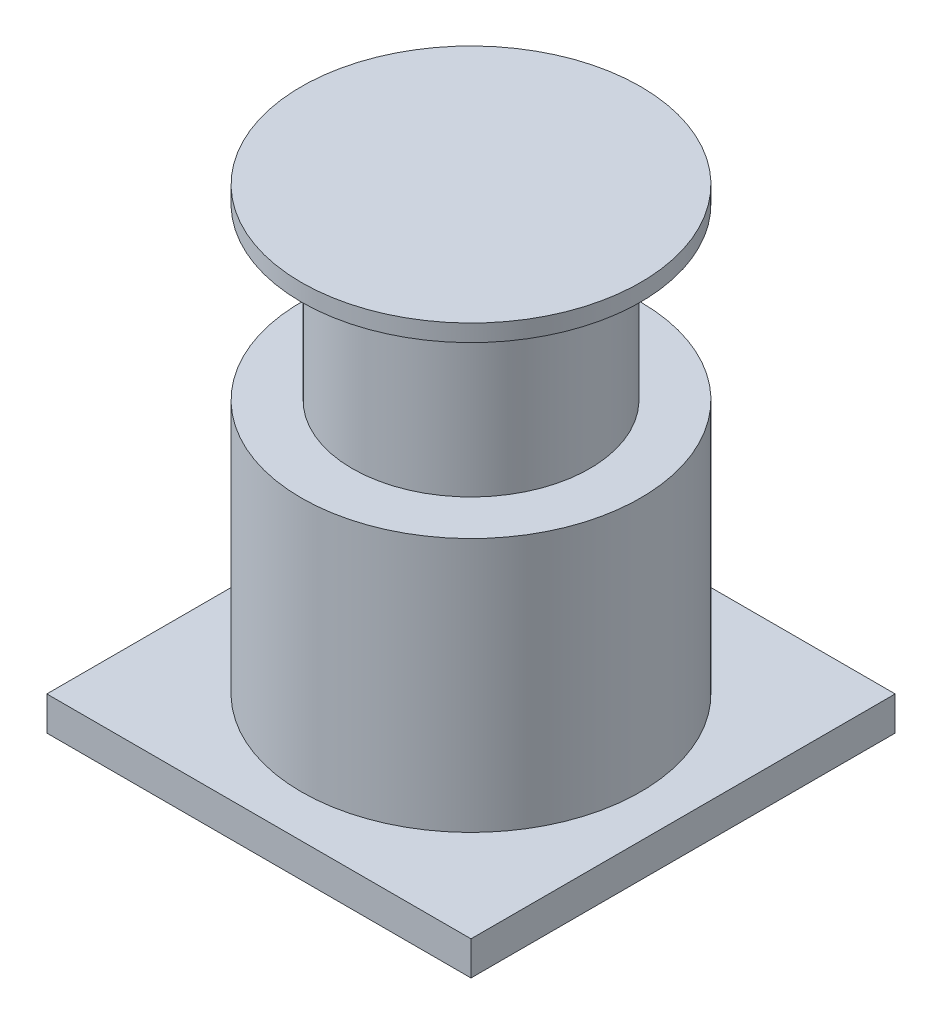
ISO-10303-21;
HEADER;
FILE_DESCRIPTION(('STEP AP214'),'2;1');
FILE_NAME('part.step','',(''),(''),'','','');
FILE_SCHEMA(('AUTOMOTIVE_DESIGN { 1 0 10303 214 1 1 1 1 }'));
ENDSEC;
DATA;
#1=APPLICATION_CONTEXT('core data for automotive mechanical design processes');
#2=APPLICATION_PROTOCOL_DEFINITION('international standard','automotive_design',2000,#1);
#3=PRODUCT_CONTEXT('',#1,'mechanical');
#4=PRODUCT('Part','Part','',(#3));
#5=PRODUCT_RELATED_PRODUCT_CATEGORY('part','',(#4));
#6=PRODUCT_DEFINITION_FORMATION('','',#4);
#7=PRODUCT_DEFINITION_CONTEXT('part definition',#1,'design');
#8=PRODUCT_DEFINITION('design','',#6,#7);
#9=PRODUCT_DEFINITION_SHAPE('','',#8);
#10=(LENGTH_UNIT() NAMED_UNIT(*) SI_UNIT(.MILLI.,.METRE.));
#11=(NAMED_UNIT(*) PLANE_ANGLE_UNIT() SI_UNIT($,.RADIAN.));
#12=(NAMED_UNIT(*) SI_UNIT($,.STERADIAN.) SOLID_ANGLE_UNIT());
#13=UNCERTAINTY_MEASURE_WITH_UNIT(LENGTH_MEASURE(1.E-05),#10,'distance_accuracy_value','');
#14=(GEOMETRIC_REPRESENTATION_CONTEXT(3) GLOBAL_UNCERTAINTY_ASSIGNED_CONTEXT((#13)) GLOBAL_UNIT_ASSIGNED_CONTEXT((#10,
#11,#12)) REPRESENTATION_CONTEXT('',''));
#15=CARTESIAN_POINT('',(0.,0.,0.));
#16=DIRECTION('',(0.,0.,1.));
#17=DIRECTION('',(1.,0.,0.));
#18=AXIS2_PLACEMENT_3D('',#15,#16,#17);
#19=CARTESIAN_POINT('',(-78.1893004115226,20.,163.168724279835));
#20=DIRECTION('',(1.,0.,0.));
#21=DIRECTION('',(0.,0.,-1.));
#22=AXIS2_PLACEMENT_3D('',#19,#20,#21);
#23=PLANE('',#22);
#24=DIRECTION('',(0.,0.,1.));
#25=VECTOR('',#24,1.);
#26=CARTESIAN_POINT('',(-78.1893004115226,0.,163.168724279835));
#27=LINE('',#26,#25);
#28=CARTESIAN_POINT('',(-78.1893004115226,0.,-86.8312757201647));
#29=VERTEX_POINT('',#28);
#30=CARTESIAN_POINT('',(-78.1893004115226,0.,163.168724279835));
#31=VERTEX_POINT('',#30);
#32=EDGE_CURVE('E117',#29,#31,#27,.T.);
#33=ORIENTED_EDGE('',*,*,#32,.T.);
#34=DIRECTION('',(0.,-1.,0.));
#35=VECTOR('',#34,1.);
#36=CARTESIAN_POINT('',(-78.1893004115226,20.,163.168724279835));
#37=LINE('',#36,#35);
#38=CARTESIAN_POINT('',(-78.1893004115226,20.,163.168724279835));
#39=VERTEX_POINT('',#38);
#40=EDGE_CURVE('E48',#39,#31,#37,.T.);
#41=ORIENTED_EDGE('',*,*,#40,.F.);
#42=DIRECTION('',(0.,0.,1.));
#43=VECTOR('',#42,1.);
#44=CARTESIAN_POINT('',(-78.1893004115226,20.,163.168724279835));
#45=LINE('',#44,#43);
#46=CARTESIAN_POINT('',(-78.1893004115226,20.,-86.8312757201647));
#47=VERTEX_POINT('',#46);
#48=EDGE_CURVE('E100',#47,#39,#45,.T.);
#49=ORIENTED_EDGE('',*,*,#48,.F.);
#50=DIRECTION('',(0.,-1.,0.));
#51=VECTOR('',#50,1.);
#52=CARTESIAN_POINT('',(-78.1893004115226,20.,-86.8312757201647));
#53=LINE('',#52,#51);
#54=EDGE_CURVE('E113',#47,#29,#53,.T.);
#55=ORIENTED_EDGE('',*,*,#54,.T.);
#56=EDGE_LOOP('',(#33,#41,#49,#55));
#57=FACE_BOUND('',#56,.T.);
#58=ADVANCED_FACE('F45',(#57),#23,.F.);
#59=CARTESIAN_POINT('',(-78.1893004115226,20.,163.168724279835));
#60=DIRECTION('',(0.,0.,-1.));
#61=DIRECTION('',(-1.,0.,0.));
#62=AXIS2_PLACEMENT_3D('',#59,#60,#61);
#63=PLANE('',#62);
#64=DIRECTION('',(1.,0.,0.));
#65=VECTOR('',#64,1.);
#66=CARTESIAN_POINT('',(-78.1893004115226,0.,163.168724279835));
#67=LINE('',#66,#65);
#68=CARTESIAN_POINT('',(171.810699588477,0.,163.168724279835));
#69=VERTEX_POINT('',#68);
#70=EDGE_CURVE('E106',#31,#69,#67,.T.);
#71=ORIENTED_EDGE('',*,*,#70,.T.);
#72=DIRECTION('',(0.,-1.,0.));
#73=VECTOR('',#72,1.);
#74=CARTESIAN_POINT('',(171.810699588477,20.,163.168724279835));
#75=LINE('',#74,#73);
#76=CARTESIAN_POINT('',(171.810699588477,20.,163.168724279835));
#77=VERTEX_POINT('',#76);
#78=EDGE_CURVE('E104',#77,#69,#75,.T.);
#79=ORIENTED_EDGE('',*,*,#78,.F.);
#80=DIRECTION('',(1.,0.,0.));
#81=VECTOR('',#80,1.);
#82=CARTESIAN_POINT('',(-78.1893004115226,20.,163.168724279835));
#83=LINE('',#82,#81);
#84=EDGE_CURVE('E95',#39,#77,#83,.T.);
#85=ORIENTED_EDGE('',*,*,#84,.F.);
#86=ORIENTED_EDGE('',*,*,#40,.T.);
#87=EDGE_LOOP('',(#71,#79,#85,#86));
#88=FACE_BOUND('',#87,.T.);
#89=ADVANCED_FACE('F105',(#88),#63,.F.);
#90=CARTESIAN_POINT('',(171.810699588477,20.,163.168724279835));
#91=DIRECTION('',(-1.,0.,0.));
#92=DIRECTION('',(0.,0.,1.));
#93=AXIS2_PLACEMENT_3D('',#90,#91,#92);
#94=PLANE('',#93);
#95=DIRECTION('',(0.,0.,-1.));
#96=VECTOR('',#95,1.);
#97=CARTESIAN_POINT('',(171.810699588477,0.,163.168724279835));
#98=LINE('',#97,#96);
#99=CARTESIAN_POINT('',(171.810699588477,0.,-86.8312757201647));
#100=VERTEX_POINT('',#99);
#101=EDGE_CURVE('E81',#69,#100,#98,.T.);
#102=ORIENTED_EDGE('',*,*,#101,.T.);
#103=DIRECTION('',(0.,-1.,0.));
#104=VECTOR('',#103,1.);
#105=CARTESIAN_POINT('',(171.810699588477,20.,-86.8312757201647));
#106=LINE('',#105,#104);
#107=CARTESIAN_POINT('',(171.810699588477,20.,-86.8312757201647));
#108=VERTEX_POINT('',#107);
#109=EDGE_CURVE('E108',#108,#100,#106,.T.);
#110=ORIENTED_EDGE('',*,*,#109,.F.);
#111=DIRECTION('',(0.,0.,-1.));
#112=VECTOR('',#111,1.);
#113=CARTESIAN_POINT('',(171.810699588477,20.,163.168724279835));
#114=LINE('',#113,#112);
#115=EDGE_CURVE('E98',#77,#108,#114,.T.);
#116=ORIENTED_EDGE('',*,*,#115,.F.);
#117=ORIENTED_EDGE('',*,*,#78,.T.);
#118=EDGE_LOOP('',(#102,#110,#116,#117));
#119=FACE_BOUND('',#118,.T.);
#120=ADVANCED_FACE('F109',(#119),#94,.F.);
#121=CARTESIAN_POINT('',(-78.1893004115226,20.,-86.8312757201647));
#122=DIRECTION('',(0.,0.,1.));
#123=DIRECTION('',(1.,0.,0.));
#124=AXIS2_PLACEMENT_3D('',#121,#122,#123);
#125=PLANE('',#124);
#126=DIRECTION('',(-1.,0.,0.));
#127=VECTOR('',#126,1.);
#128=CARTESIAN_POINT('',(-78.1893004115226,0.,-86.8312757201647));
#129=LINE('',#128,#127);
#130=EDGE_CURVE('E87',#100,#29,#129,.T.);
#131=ORIENTED_EDGE('',*,*,#130,.T.);
#132=ORIENTED_EDGE('',*,*,#54,.F.);
#133=DIRECTION('',(-1.,0.,0.));
#134=VECTOR('',#133,1.);
#135=CARTESIAN_POINT('',(-78.1893004115226,20.,-86.8312757201647));
#136=LINE('',#135,#134);
#137=EDGE_CURVE('E64',#108,#47,#136,.T.);
#138=ORIENTED_EDGE('',*,*,#137,.F.);
#139=ORIENTED_EDGE('',*,*,#109,.T.);
#140=EDGE_LOOP('',(#131,#132,#138,#139));
#141=FACE_BOUND('',#140,.T.);
#142=ADVANCED_FACE('F131',(#141),#125,.F.);
#143=CARTESIAN_POINT('',(0.,20.,0.));
#144=DIRECTION('',(0.,-1.,0.));
#145=DIRECTION('',(0.,0.,-1.));
#146=AXIS2_PLACEMENT_3D('',#143,#144,#145);
#147=PLANE('',#146);
#148=CARTESIAN_POINT('',(46.8106995884774,20.,38.1687242798354));
#149=DIRECTION('',(0.,1.,0.));
#150=DIRECTION('',(0.,0.,1.));
#151=AXIS2_PLACEMENT_3D('',#148,#149,#150);
#152=CIRCLE('',#151,100.);
#153=CARTESIAN_POINT('',(46.8106995884774,20.,138.168724279835));
#154=VERTEX_POINT('',#153);
#155=EDGE_CURVE('E55',#154,#154,#152,.T.);
#156=ORIENTED_EDGE('',*,*,#155,.F.);
#157=EDGE_LOOP('',(#156));
#158=FACE_BOUND('',#157,.T.);
#159=ORIENTED_EDGE('',*,*,#48,.T.);
#160=ORIENTED_EDGE('',*,*,#84,.T.);
#161=ORIENTED_EDGE('',*,*,#115,.T.);
#162=ORIENTED_EDGE('',*,*,#137,.T.);
#163=EDGE_LOOP('',(#159,#160,#161,#162));
#164=FACE_BOUND('',#163,.T.);
#165=ADVANCED_FACE('F96',(#158,#164),#147,.F.);
#166=CARTESIAN_POINT('',(0.,0.,0.));
#167=DIRECTION('',(0.,-1.,0.));
#168=DIRECTION('',(0.,0.,-1.));
#169=AXIS2_PLACEMENT_3D('',#166,#167,#168);
#170=PLANE('',#169);
#171=ORIENTED_EDGE('',*,*,#32,.F.);
#172=ORIENTED_EDGE('',*,*,#130,.F.);
#173=ORIENTED_EDGE('',*,*,#101,.F.);
#174=ORIENTED_EDGE('',*,*,#70,.F.);
#175=EDGE_LOOP('',(#171,#172,#173,#174));
#176=FACE_BOUND('',#175,.T.);
#177=ADVANCED_FACE('F134',(#176),#170,.T.);
#178=CARTESIAN_POINT('',(46.8106995884774,170.,38.1687242798354));
#179=DIRECTION('',(0.,-1.,0.));
#180=DIRECTION('',(0.,0.,-1.));
#181=AXIS2_PLACEMENT_3D('',#178,#179,#180);
#182=CYLINDRICAL_SURFACE('',#181,100.);
#183=CARTESIAN_POINT('',(46.8106995884774,170.,38.1687242798354));
#184=DIRECTION('',(0.,1.,0.));
#185=DIRECTION('',(0.,0.,1.));
#186=AXIS2_PLACEMENT_3D('',#183,#184,#185);
#187=CIRCLE('',#186,100.);
#188=CARTESIAN_POINT('',(46.8106995884774,170.,138.168724279835));
#189=VERTEX_POINT('',#188);
#190=EDGE_CURVE('E121',#189,#189,#187,.T.);
#191=ORIENTED_EDGE('',*,*,#190,.F.);
#192=EDGE_LOOP('',(#191));
#193=FACE_BOUND('',#192,.T.);
#194=ORIENTED_EDGE('',*,*,#155,.T.);
#195=EDGE_LOOP('',(#194));
#196=FACE_BOUND('',#195,.T.);
#197=ADVANCED_FACE('F187',(#193,#196),#182,.T.);
#198=CARTESIAN_POINT('',(46.8106995884774,170.,38.1687242798354));
#199=DIRECTION('',(0.,1.,0.));
#200=DIRECTION('',(0.,0.,1.));
#201=AXIS2_PLACEMENT_3D('',#198,#199,#200);
#202=PLANE('',#201);
#203=CARTESIAN_POINT('',(46.8106995884774,170.,38.1687242798354));
#204=DIRECTION('',(0.,1.,0.));
#205=DIRECTION('',(0.,0.,1.));
#206=AXIS2_PLACEMENT_3D('',#203,#204,#205);
#207=CIRCLE('',#206,70.);
#208=CARTESIAN_POINT('',(46.8106995884774,170.,108.168724279835));
#209=VERTEX_POINT('',#208);
#210=EDGE_CURVE('E11',#209,#209,#207,.T.);
#211=ORIENTED_EDGE('',*,*,#210,.F.);
#212=EDGE_LOOP('',(#211));
#213=FACE_BOUND('',#212,.T.);
#214=ORIENTED_EDGE('',*,*,#190,.T.);
#215=EDGE_LOOP('',(#214));
#216=FACE_BOUND('',#215,.T.);
#217=ADVANCED_FACE('F193',(#213,#216),#202,.T.);
#218=CARTESIAN_POINT('',(46.8106995884774,270.,38.1687242798354));
#219=DIRECTION('',(0.,-1.,0.));
#220=DIRECTION('',(0.,0.,-1.));
#221=AXIS2_PLACEMENT_3D('',#218,#219,#220);
#222=CYLINDRICAL_SURFACE('',#221,70.);
#223=CARTESIAN_POINT('',(46.8106995884774,270.,38.1687242798354));
#224=DIRECTION('',(0.,1.,0.));
#225=DIRECTION('',(0.,0.,1.));
#226=AXIS2_PLACEMENT_3D('',#223,#224,#225);
#227=CIRCLE('',#226,70.);
#228=CARTESIAN_POINT('',(46.8106995884774,270.,108.168724279835));
#229=VERTEX_POINT('',#228);
#230=EDGE_CURVE('E143',#229,#229,#227,.T.);
#231=ORIENTED_EDGE('',*,*,#230,.F.);
#232=EDGE_LOOP('',(#231));
#233=FACE_BOUND('',#232,.T.);
#234=ORIENTED_EDGE('',*,*,#210,.T.);
#235=EDGE_LOOP('',(#234));
#236=FACE_BOUND('',#235,.T.);
#237=ADVANCED_FACE('F162',(#233,#236),#222,.T.);
#238=CARTESIAN_POINT('',(46.8106995884774,280.,38.1687242798354));
#239=DIRECTION('',(0.,-1.,0.));
#240=DIRECTION('',(0.,0.,-1.));
#241=AXIS2_PLACEMENT_3D('',#238,#239,#240);
#242=CYLINDRICAL_SURFACE('',#241,100.);
#243=CARTESIAN_POINT('',(46.8106995884774,280.,38.1687242798354));
#244=DIRECTION('',(0.,1.,0.));
#245=DIRECTION('',(0.,0.,1.));
#246=AXIS2_PLACEMENT_3D('',#243,#244,#245);
#247=CIRCLE('',#246,100.);
#248=CARTESIAN_POINT('',(46.8106995884774,280.,138.168724279835));
#249=VERTEX_POINT('',#248);
#250=EDGE_CURVE('E148',#249,#249,#247,.T.);
#251=ORIENTED_EDGE('',*,*,#250,.F.);
#252=EDGE_LOOP('',(#251));
#253=FACE_BOUND('',#252,.T.);
#254=CARTESIAN_POINT('',(46.8106995884774,270.,38.1687242798354));
#255=DIRECTION('',(0.,1.,0.));
#256=DIRECTION('',(0.,0.,1.));
#257=AXIS2_PLACEMENT_3D('',#254,#255,#256);
#258=CIRCLE('',#257,100.);
#259=CARTESIAN_POINT('',(46.8106995884774,270.,138.168724279835));
#260=VERTEX_POINT('',#259);
#261=EDGE_CURVE('E149',#260,#260,#258,.T.);
#262=ORIENTED_EDGE('',*,*,#261,.T.);
#263=EDGE_LOOP('',(#262));
#264=FACE_BOUND('',#263,.T.);
#265=ADVANCED_FACE('F159',(#253,#264),#242,.T.);
#266=CARTESIAN_POINT('',(46.8106995884774,280.,38.1687242798354));
#267=DIRECTION('',(0.,1.,0.));
#268=DIRECTION('',(0.,0.,1.));
#269=AXIS2_PLACEMENT_3D('',#266,#267,#268);
#270=PLANE('',#269);
#271=ORIENTED_EDGE('',*,*,#250,.T.);
#272=EDGE_LOOP('',(#271));
#273=FACE_BOUND('',#272,.T.);
#274=ADVANCED_FACE('F157',(#273),#270,.T.);
#275=CARTESIAN_POINT('',(46.8106995884774,270.,38.1687242798354));
#276=DIRECTION('',(0.,1.,0.));
#277=DIRECTION('',(0.,0.,1.));
#278=AXIS2_PLACEMENT_3D('',#275,#276,#277);
#279=PLANE('',#278);
#280=ORIENTED_EDGE('',*,*,#230,.T.);
#281=EDGE_LOOP('',(#280));
#282=FACE_BOUND('',#281,.T.);
#283=ORIENTED_EDGE('',*,*,#261,.F.);
#284=EDGE_LOOP('',(#283));
#285=FACE_BOUND('',#284,.T.);
#286=ADVANCED_FACE('F166',(#282,#285),#279,.F.);
#287=CLOSED_SHELL('',(#58,#89,#120,#142,#165,#177,#197,#217,#237,#265,#274,#286));
#288=MANIFOLD_SOLID_BREP('B2',#287);
#289=ADVANCED_BREP_SHAPE_REPRESENTATION('',(#18,#288),#14);
#290=SHAPE_DEFINITION_REPRESENTATION(#9,#289);
ENDSEC;
END-ISO-10303-21;
